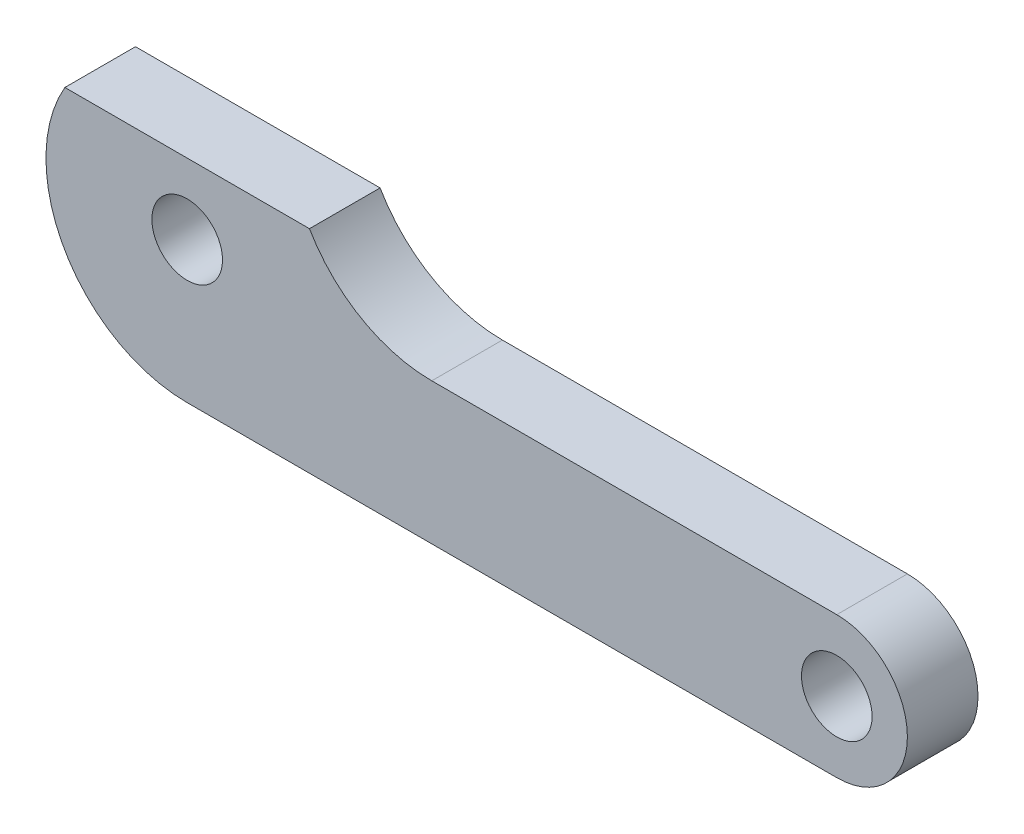
ISO-10303-21;
HEADER;
FILE_DESCRIPTION(('STEP AP214'),'2;1');
FILE_NAME('part.step','',(''),(''),'','','');
FILE_SCHEMA(('AUTOMOTIVE_DESIGN { 1 0 10303 214 1 1 1 1 }'));
ENDSEC;
DATA;
#1=APPLICATION_CONTEXT('core data for automotive mechanical design processes');
#2=APPLICATION_PROTOCOL_DEFINITION('international standard','automotive_design',2000,#1);
#3=PRODUCT_CONTEXT('',#1,'mechanical');
#4=PRODUCT('Part','Part','',(#3));
#5=PRODUCT_RELATED_PRODUCT_CATEGORY('part','',(#4));
#6=PRODUCT_DEFINITION_FORMATION('','',#4);
#7=PRODUCT_DEFINITION_CONTEXT('part definition',#1,'design');
#8=PRODUCT_DEFINITION('design','',#6,#7);
#9=PRODUCT_DEFINITION_SHAPE('','',#8);
#10=(LENGTH_UNIT() NAMED_UNIT(*) SI_UNIT(.MILLI.,.METRE.));
#11=(NAMED_UNIT(*) PLANE_ANGLE_UNIT() SI_UNIT($,.RADIAN.));
#12=(NAMED_UNIT(*) SI_UNIT($,.STERADIAN.) SOLID_ANGLE_UNIT());
#13=UNCERTAINTY_MEASURE_WITH_UNIT(LENGTH_MEASURE(1.E-05),#10,'distance_accuracy_value','');
#14=(GEOMETRIC_REPRESENTATION_CONTEXT(3) GLOBAL_UNCERTAINTY_ASSIGNED_CONTEXT((#13)) GLOBAL_UNIT_ASSIGNED_CONTEXT((#10,
#11,#12)) REPRESENTATION_CONTEXT('',''));
#15=CARTESIAN_POINT('',(0.,0.,0.));
#16=DIRECTION('',(0.,0.,1.));
#17=DIRECTION('',(1.,0.,0.));
#18=AXIS2_PLACEMENT_3D('',#15,#16,#17);
#19=CARTESIAN_POINT('',(0.,5.,5.));
#20=DIRECTION('',(0.,0.,-1.));
#21=DIRECTION('',(-1.,0.,0.));
#22=AXIS2_PLACEMENT_3D('',#19,#20,#21);
#23=PLANE('',#22);
#24=CARTESIAN_POINT('',(-28.6794919243112,20.,5.));
#25=DIRECTION('',(0.,0.,-1.));
#26=DIRECTION('',(-1.,0.,0.));
#27=AXIS2_PLACEMENT_3D('',#24,#25,#26);
#28=CIRCLE('',#27,10.);
#29=CARTESIAN_POINT('',(-28.6794919243112,10.,5.));
#30=VERTEX_POINT('',#29);
#31=CARTESIAN_POINT('',(-37.3397459621556,15.,5.));
#32=VERTEX_POINT('',#31);
#33=EDGE_CURVE('E11',#30,#32,#28,.T.);
#34=ORIENTED_EDGE('',*,*,#33,.T.);
#35=DIRECTION('',(1.,0.,0.));
#36=VECTOR('',#35,1.);
#37=CARTESIAN_POINT('',(-56.,15.,5.));
#38=LINE('',#37,#36);
#39=CARTESIAN_POINT('',(-54.6602540378444,15.,5.));
#40=VERTEX_POINT('',#39);
#41=EDGE_CURVE('E89',#40,#32,#38,.T.);
#42=ORIENTED_EDGE('',*,*,#41,.F.);
#43=CARTESIAN_POINT('',(-46.,9.99999999999999,5.));
#44=DIRECTION('',(0.,0.,1.));
#45=DIRECTION('',(-1.,0.,0.));
#46=AXIS2_PLACEMENT_3D('',#43,#44,#45);
#47=CIRCLE('',#46,10.);
#48=CARTESIAN_POINT('',(-46.,0.,5.));
#49=VERTEX_POINT('',#48);
#50=EDGE_CURVE('E123',#40,#49,#47,.T.);
#51=ORIENTED_EDGE('',*,*,#50,.T.);
#52=DIRECTION('',(1.,0.,0.));
#53=VECTOR('',#52,1.);
#54=CARTESIAN_POINT('',(0.,0.,5.));
#55=LINE('',#54,#53);
#56=CARTESIAN_POINT('',(0.,0.,5.));
#57=VERTEX_POINT('',#56);
#58=EDGE_CURVE('E111',#49,#57,#55,.T.);
#59=ORIENTED_EDGE('',*,*,#58,.T.);
#60=CARTESIAN_POINT('',(0.,5.,5.));
#61=DIRECTION('',(0.,0.,1.));
#62=DIRECTION('',(-1.,0.,0.));
#63=AXIS2_PLACEMENT_3D('',#60,#61,#62);
#64=CIRCLE('',#63,5.);
#65=CARTESIAN_POINT('',(0.,10.,5.));
#66=VERTEX_POINT('',#65);
#67=EDGE_CURVE('E114',#57,#66,#64,.T.);
#68=ORIENTED_EDGE('',*,*,#67,.T.);
#69=DIRECTION('',(-1.,0.,0.));
#70=VECTOR('',#69,1.);
#71=CARTESIAN_POINT('',(0.,10.,5.));
#72=LINE('',#71,#70);
#73=EDGE_CURVE('E125',#66,#30,#72,.T.);
#74=ORIENTED_EDGE('',*,*,#73,.T.);
#75=EDGE_LOOP('',(#34,#42,#51,#59,#68,#74));
#76=FACE_BOUND('',#75,.T.);
#77=CARTESIAN_POINT('',(-46.,9.99999999999999,5.));
#78=DIRECTION('',(0.,0.,1.));
#79=DIRECTION('',(1.,0.,0.));
#80=AXIS2_PLACEMENT_3D('',#77,#78,#79);
#81=CIRCLE('',#80,2.5);
#82=CARTESIAN_POINT('',(-43.5,9.99999999999999,5.));
#83=VERTEX_POINT('',#82);
#84=EDGE_CURVE('E121',#83,#83,#81,.T.);
#85=ORIENTED_EDGE('',*,*,#84,.F.);
#86=EDGE_LOOP('',(#85));
#87=FACE_BOUND('',#86,.T.);
#88=CARTESIAN_POINT('',(0.,5.,5.));
#89=DIRECTION('',(0.,0.,1.));
#90=DIRECTION('',(1.,0.,0.));
#91=AXIS2_PLACEMENT_3D('',#88,#89,#90);
#92=CIRCLE('',#91,2.5);
#93=CARTESIAN_POINT('',(2.5,5.,5.));
#94=VERTEX_POINT('',#93);
#95=EDGE_CURVE('E132',#94,#94,#92,.T.);
#96=ORIENTED_EDGE('',*,*,#95,.F.);
#97=EDGE_LOOP('',(#96));
#98=FACE_BOUND('',#97,.T.);
#99=ADVANCED_FACE('F32',(#76,#87,#98),#23,.F.);
#100=CARTESIAN_POINT('',(0.,5.,0.));
#101=DIRECTION('',(0.,0.,-1.));
#102=DIRECTION('',(-1.,0.,0.));
#103=AXIS2_PLACEMENT_3D('',#100,#101,#102);
#104=PLANE('',#103);
#105=DIRECTION('',(1.,0.,0.));
#106=VECTOR('',#105,1.);
#107=CARTESIAN_POINT('',(-56.,15.,0.));
#108=LINE('',#107,#106);
#109=CARTESIAN_POINT('',(-54.6602540378444,15.,0.));
#110=VERTEX_POINT('',#109);
#111=CARTESIAN_POINT('',(-37.3397459621556,15.,0.));
#112=VERTEX_POINT('',#111);
#113=EDGE_CURVE('E86',#110,#112,#108,.T.);
#114=ORIENTED_EDGE('',*,*,#113,.T.);
#115=CARTESIAN_POINT('',(-28.6794919243112,20.,0.));
#116=DIRECTION('',(0.,0.,-1.));
#117=DIRECTION('',(-1.,0.,0.));
#118=AXIS2_PLACEMENT_3D('',#115,#116,#117);
#119=CIRCLE('',#118,10.);
#120=CARTESIAN_POINT('',(-28.6794919243112,10.,0.));
#121=VERTEX_POINT('',#120);
#122=EDGE_CURVE('E40',#112,#121,#119,.F.);
#123=ORIENTED_EDGE('',*,*,#122,.T.);
#124=DIRECTION('',(-1.,0.,0.));
#125=VECTOR('',#124,1.);
#126=CARTESIAN_POINT('',(0.,10.,0.));
#127=LINE('',#126,#125);
#128=CARTESIAN_POINT('',(0.,10.,0.));
#129=VERTEX_POINT('',#128);
#130=EDGE_CURVE('E116',#129,#121,#127,.T.);
#131=ORIENTED_EDGE('',*,*,#130,.F.);
#132=CARTESIAN_POINT('',(0.,5.,0.));
#133=DIRECTION('',(0.,0.,1.));
#134=DIRECTION('',(-1.,0.,0.));
#135=AXIS2_PLACEMENT_3D('',#132,#133,#134);
#136=CIRCLE('',#135,5.);
#137=CARTESIAN_POINT('',(0.,0.,0.));
#138=VERTEX_POINT('',#137);
#139=EDGE_CURVE('E118',#138,#129,#136,.T.);
#140=ORIENTED_EDGE('',*,*,#139,.F.);
#141=DIRECTION('',(1.,0.,0.));
#142=VECTOR('',#141,1.);
#143=CARTESIAN_POINT('',(0.,0.,0.));
#144=LINE('',#143,#142);
#145=CARTESIAN_POINT('',(-46.,0.,0.));
#146=VERTEX_POINT('',#145);
#147=EDGE_CURVE('E112',#146,#138,#144,.T.);
#148=ORIENTED_EDGE('',*,*,#147,.F.);
#149=CARTESIAN_POINT('',(-46.,9.99999999999999,0.));
#150=DIRECTION('',(0.,0.,1.));
#151=DIRECTION('',(-1.,0.,0.));
#152=AXIS2_PLACEMENT_3D('',#149,#150,#151);
#153=CIRCLE('',#152,10.);
#154=EDGE_CURVE('E98',#110,#146,#153,.T.);
#155=ORIENTED_EDGE('',*,*,#154,.F.);
#156=EDGE_LOOP('',(#114,#123,#131,#140,#148,#155));
#157=FACE_BOUND('',#156,.T.);
#158=CARTESIAN_POINT('',(-46.,9.99999999999999,0.));
#159=DIRECTION('',(0.,0.,1.));
#160=DIRECTION('',(1.,0.,0.));
#161=AXIS2_PLACEMENT_3D('',#158,#159,#160);
#162=CIRCLE('',#161,2.5);
#163=CARTESIAN_POINT('',(-43.5,9.99999999999999,0.));
#164=VERTEX_POINT('',#163);
#165=EDGE_CURVE('E129',#164,#164,#162,.T.);
#166=ORIENTED_EDGE('',*,*,#165,.T.);
#167=EDGE_LOOP('',(#166));
#168=FACE_BOUND('',#167,.T.);
#169=CARTESIAN_POINT('',(0.,5.,0.));
#170=DIRECTION('',(0.,0.,1.));
#171=DIRECTION('',(1.,0.,0.));
#172=AXIS2_PLACEMENT_3D('',#169,#170,#171);
#173=CIRCLE('',#172,2.5);
#174=CARTESIAN_POINT('',(2.5,5.,0.));
#175=VERTEX_POINT('',#174);
#176=EDGE_CURVE('E135',#175,#175,#173,.T.);
#177=ORIENTED_EDGE('',*,*,#176,.T.);
#178=EDGE_LOOP('',(#177));
#179=FACE_BOUND('',#178,.T.);
#180=ADVANCED_FACE('F95',(#157,#168,#179),#104,.T.);
#181=CARTESIAN_POINT('',(0.,5.,5.));
#182=DIRECTION('',(0.,0.,-1.));
#183=DIRECTION('',(-1.,0.,0.));
#184=AXIS2_PLACEMENT_3D('',#181,#182,#183);
#185=CYLINDRICAL_SURFACE('',#184,5.);
#186=ORIENTED_EDGE('',*,*,#139,.T.);
#187=DIRECTION('',(0.,0.,-1.));
#188=VECTOR('',#187,1.);
#189=CARTESIAN_POINT('',(0.,10.,5.));
#190=LINE('',#189,#188);
#191=EDGE_CURVE('E92',#66,#129,#190,.T.);
#192=ORIENTED_EDGE('',*,*,#191,.F.);
#193=ORIENTED_EDGE('',*,*,#67,.F.);
#194=DIRECTION('',(0.,0.,-1.));
#195=VECTOR('',#194,1.);
#196=CARTESIAN_POINT('',(0.,0.,5.));
#197=LINE('',#196,#195);
#198=EDGE_CURVE('E108',#57,#138,#197,.T.);
#199=ORIENTED_EDGE('',*,*,#198,.T.);
#200=EDGE_LOOP('',(#186,#192,#193,#199));
#201=FACE_BOUND('',#200,.T.);
#202=ADVANCED_FACE('F152',(#201),#185,.T.);
#203=CARTESIAN_POINT('',(0.,10.,5.));
#204=DIRECTION('',(0.,-1.,0.));
#205=DIRECTION('',(1.,0.,0.));
#206=AXIS2_PLACEMENT_3D('',#203,#204,#205);
#207=PLANE('',#206);
#208=ORIENTED_EDGE('',*,*,#130,.T.);
#209=DIRECTION('',(0.,0.,1.));
#210=VECTOR('',#209,1.);
#211=CARTESIAN_POINT('',(-28.6794919243112,10.,5.));
#212=LINE('',#211,#210);
#213=EDGE_CURVE('E47',#121,#30,#212,.T.);
#214=ORIENTED_EDGE('',*,*,#213,.T.);
#215=ORIENTED_EDGE('',*,*,#73,.F.);
#216=ORIENTED_EDGE('',*,*,#191,.T.);
#217=EDGE_LOOP('',(#208,#214,#215,#216));
#218=FACE_BOUND('',#217,.T.);
#219=ADVANCED_FACE('F149',(#218),#207,.F.);
#220=CARTESIAN_POINT('',(-46.,9.99999999999999,5.));
#221=DIRECTION('',(0.,0.,-1.));
#222=DIRECTION('',(-1.,0.,0.));
#223=AXIS2_PLACEMENT_3D('',#220,#221,#222);
#224=CYLINDRICAL_SURFACE('',#223,10.);
#225=ORIENTED_EDGE('',*,*,#50,.F.);
#226=DIRECTION('',(0.,0.,-1.));
#227=VECTOR('',#226,1.);
#228=CARTESIAN_POINT('',(-54.6602540378444,15.,5.));
#229=LINE('',#228,#227);
#230=EDGE_CURVE('E99',#40,#110,#229,.T.);
#231=ORIENTED_EDGE('',*,*,#230,.T.);
#232=ORIENTED_EDGE('',*,*,#154,.T.);
#233=DIRECTION('',(0.,0.,-1.));
#234=VECTOR('',#233,1.);
#235=CARTESIAN_POINT('',(-46.,0.,5.));
#236=LINE('',#235,#234);
#237=EDGE_CURVE('E105',#49,#146,#236,.T.);
#238=ORIENTED_EDGE('',*,*,#237,.F.);
#239=EDGE_LOOP('',(#225,#231,#232,#238));
#240=FACE_BOUND('',#239,.T.);
#241=ADVANCED_FACE('F143',(#240),#224,.T.);
#242=CARTESIAN_POINT('',(0.,0.,5.));
#243=DIRECTION('',(0.,1.,0.));
#244=DIRECTION('',(-1.,0.,0.));
#245=AXIS2_PLACEMENT_3D('',#242,#243,#244);
#246=PLANE('',#245);
#247=ORIENTED_EDGE('',*,*,#147,.T.);
#248=ORIENTED_EDGE('',*,*,#198,.F.);
#249=ORIENTED_EDGE('',*,*,#58,.F.);
#250=ORIENTED_EDGE('',*,*,#237,.T.);
#251=EDGE_LOOP('',(#247,#248,#249,#250));
#252=FACE_BOUND('',#251,.T.);
#253=ADVANCED_FACE('F155',(#252),#246,.F.);
#254=CARTESIAN_POINT('',(-46.,9.99999999999999,5.));
#255=DIRECTION('',(0.,0.,-1.));
#256=DIRECTION('',(-1.,0.,0.));
#257=AXIS2_PLACEMENT_3D('',#254,#255,#256);
#258=CYLINDRICAL_SURFACE('',#257,2.5);
#259=ORIENTED_EDGE('',*,*,#84,.T.);
#260=EDGE_LOOP('',(#259));
#261=FACE_BOUND('',#260,.T.);
#262=ORIENTED_EDGE('',*,*,#165,.F.);
#263=EDGE_LOOP('',(#262));
#264=FACE_BOUND('',#263,.T.);
#265=ADVANCED_FACE('F158',(#261,#264),#258,.F.);
#266=CARTESIAN_POINT('',(0.,5.,5.));
#267=DIRECTION('',(0.,0.,-1.));
#268=DIRECTION('',(-1.,0.,0.));
#269=AXIS2_PLACEMENT_3D('',#266,#267,#268);
#270=CYLINDRICAL_SURFACE('',#269,2.5);
#271=ORIENTED_EDGE('',*,*,#95,.T.);
#272=EDGE_LOOP('',(#271));
#273=FACE_BOUND('',#272,.T.);
#274=ORIENTED_EDGE('',*,*,#176,.F.);
#275=EDGE_LOOP('',(#274));
#276=FACE_BOUND('',#275,.T.);
#277=ADVANCED_FACE('F164',(#273,#276),#270,.F.);
#278=CARTESIAN_POINT('',(-28.6794919243112,20.,5.));
#279=DIRECTION('',(0.,0.,-1.));
#280=DIRECTION('',(-1.,0.,0.));
#281=AXIS2_PLACEMENT_3D('',#278,#279,#280);
#282=CYLINDRICAL_SURFACE('',#281,10.);
#283=ORIENTED_EDGE('',*,*,#33,.F.);
#284=ORIENTED_EDGE('',*,*,#213,.F.);
#285=ORIENTED_EDGE('',*,*,#122,.F.);
#286=DIRECTION('',(0.,0.,-1.));
#287=VECTOR('',#286,1.);
#288=CARTESIAN_POINT('',(-37.3397459621556,15.,5.));
#289=LINE('',#288,#287);
#290=EDGE_CURVE('E84',#32,#112,#289,.T.);
#291=ORIENTED_EDGE('',*,*,#290,.F.);
#292=EDGE_LOOP('',(#283,#284,#285,#291));
#293=FACE_BOUND('',#292,.T.);
#294=ADVANCED_FACE('F34',(#293),#282,.F.);
#295=CARTESIAN_POINT('',(-56.,15.,0.));
#296=DIRECTION('',(0.,-1.,0.));
#297=DIRECTION('',(0.,0.,-1.));
#298=AXIS2_PLACEMENT_3D('',#295,#296,#297);
#299=PLANE('',#298);
#300=ORIENTED_EDGE('',*,*,#41,.T.);
#301=ORIENTED_EDGE('',*,*,#290,.T.);
#302=ORIENTED_EDGE('',*,*,#113,.F.);
#303=ORIENTED_EDGE('',*,*,#230,.F.);
#304=EDGE_LOOP('',(#300,#301,#302,#303));
#305=FACE_BOUND('',#304,.T.);
#306=ADVANCED_FACE('F85',(#305),#299,.F.);
#307=CLOSED_SHELL('',(#99,#180,#202,#219,#241,#253,#265,#277,#294,#306));
#308=MANIFOLD_SOLID_BREP('B2',#307);
#309=ADVANCED_BREP_SHAPE_REPRESENTATION('',(#18,#308),#14);
#310=SHAPE_DEFINITION_REPRESENTATION(#9,#309);
ENDSEC;
END-ISO-10303-21;
